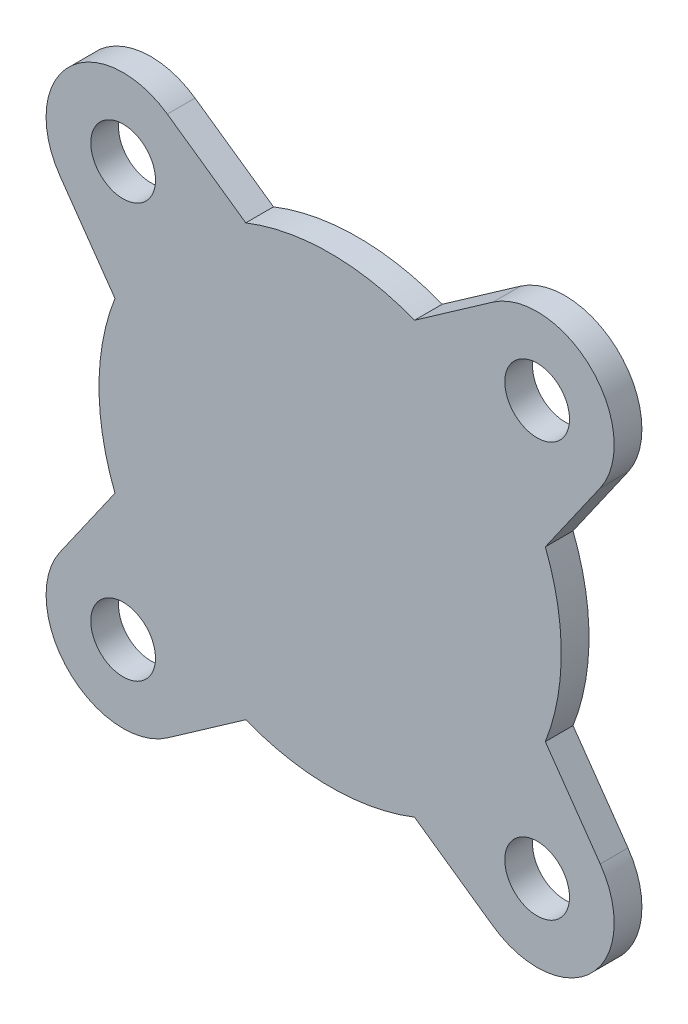
ISO-10303-21;
HEADER;
FILE_DESCRIPTION(('STEP AP214'),'2;1');
FILE_NAME('part.step','',(''),(''),'','','');
FILE_SCHEMA(('AUTOMOTIVE_DESIGN { 1 0 10303 214 1 1 1 1 }'));
ENDSEC;
DATA;
#1=APPLICATION_CONTEXT('core data for automotive mechanical design processes');
#2=APPLICATION_PROTOCOL_DEFINITION('international standard','automotive_design',2000,#1);
#3=PRODUCT_CONTEXT('',#1,'mechanical');
#4=PRODUCT('Part','Part','',(#3));
#5=PRODUCT_RELATED_PRODUCT_CATEGORY('part','',(#4));
#6=PRODUCT_DEFINITION_FORMATION('','',#4);
#7=PRODUCT_DEFINITION_CONTEXT('part definition',#1,'design');
#8=PRODUCT_DEFINITION('design','',#6,#7);
#9=PRODUCT_DEFINITION_SHAPE('','',#8);
#10=(LENGTH_UNIT() NAMED_UNIT(*) SI_UNIT(.MILLI.,.METRE.));
#11=(NAMED_UNIT(*) PLANE_ANGLE_UNIT() SI_UNIT($,.RADIAN.));
#12=(NAMED_UNIT(*) SI_UNIT($,.STERADIAN.) SOLID_ANGLE_UNIT());
#13=UNCERTAINTY_MEASURE_WITH_UNIT(LENGTH_MEASURE(1.E-05),#10,'distance_accuracy_value','');
#14=(GEOMETRIC_REPRESENTATION_CONTEXT(3) GLOBAL_UNCERTAINTY_ASSIGNED_CONTEXT((#13)) GLOBAL_UNIT_ASSIGNED_CONTEXT((#10,
#11,#12)) REPRESENTATION_CONTEXT('',''));
#15=CARTESIAN_POINT('',(0.,0.,0.));
#16=DIRECTION('',(0.,0.,1.));
#17=DIRECTION('',(1.,0.,0.));
#18=AXIS2_PLACEMENT_3D('',#15,#16,#17);
#19=CARTESIAN_POINT('',(0.,0.,0.9));
#20=DIRECTION('',(0.,0.,-1.));
#21=DIRECTION('',(-1.,0.,0.));
#22=AXIS2_PLACEMENT_3D('',#19,#20,#21);
#23=CYLINDRICAL_SURFACE('',#22,7.5);
#24=CARTESIAN_POINT('',(0.,0.,0.));
#25=DIRECTION('',(0.,0.,1.));
#26=DIRECTION('',(1.,0.,0.));
#27=AXIS2_PLACEMENT_3D('',#24,#25,#26);
#28=CIRCLE('',#27,7.5);
#29=CARTESIAN_POINT('',(2.73744653020183,6.9825773532619,0.));
#30=VERTEX_POINT('',#29);
#31=CARTESIAN_POINT('',(-2.73744653020183,6.9825773532619,0.));
#32=VERTEX_POINT('',#31);
#33=EDGE_CURVE('E375',#30,#32,#28,.T.);
#34=ORIENTED_EDGE('',*,*,#33,.T.);
#35=DIRECTION('',(0.,0.,-1.));
#36=VECTOR('',#35,1.);
#37=CARTESIAN_POINT('',(-2.73744653020183,6.9825773532619,0.9));
#38=LINE('',#37,#36);
#39=CARTESIAN_POINT('',(-2.73744653020183,6.9825773532619,0.9));
#40=VERTEX_POINT('',#39);
#41=EDGE_CURVE('E417',#40,#32,#38,.T.);
#42=ORIENTED_EDGE('',*,*,#41,.F.);
#43=CARTESIAN_POINT('',(0.,0.,0.9));
#44=DIRECTION('',(0.,0.,1.));
#45=DIRECTION('',(1.,0.,0.));
#46=AXIS2_PLACEMENT_3D('',#43,#44,#45);
#47=CIRCLE('',#46,7.5);
#48=CARTESIAN_POINT('',(2.73744653020183,6.9825773532619,0.9));
#49=VERTEX_POINT('',#48);
#50=EDGE_CURVE('E457',#49,#40,#47,.T.);
#51=ORIENTED_EDGE('',*,*,#50,.F.);
#52=DIRECTION('',(0.,0.,-1.));
#53=VECTOR('',#52,1.);
#54=CARTESIAN_POINT('',(2.73744653020183,6.9825773532619,0.9));
#55=LINE('',#54,#53);
#56=EDGE_CURVE('E419',#49,#30,#55,.T.);
#57=ORIENTED_EDGE('',*,*,#56,.T.);
#58=EDGE_LOOP('',(#34,#42,#51,#57));
#59=FACE_BOUND('',#58,.T.);
#60=ADVANCED_FACE('F205',(#59),#23,.T.);
#61=CARTESIAN_POINT('',(6.9825773532619,-2.73744653020183,0.));
#62=VERTEX_POINT('',#61);
#63=CARTESIAN_POINT('',(6.98257735326193,2.73744653020175,0.));
#64=VERTEX_POINT('',#63);
#65=EDGE_CURVE('E370',#62,#64,#28,.T.);
#66=ORIENTED_EDGE('',*,*,#65,.T.);
#67=DIRECTION('',(0.,0.,-1.));
#68=VECTOR('',#67,1.);
#69=CARTESIAN_POINT('',(6.98257735326193,2.73744653020175,0.9));
#70=LINE('',#69,#68);
#71=CARTESIAN_POINT('',(6.98257735326193,2.73744653020175,0.9));
#72=VERTEX_POINT('',#71);
#73=EDGE_CURVE('E426',#72,#64,#70,.T.);
#74=ORIENTED_EDGE('',*,*,#73,.F.);
#75=CARTESIAN_POINT('',(6.9825773532619,-2.73744653020183,0.9));
#76=VERTEX_POINT('',#75);
#77=EDGE_CURVE('E350',#76,#72,#47,.T.);
#78=ORIENTED_EDGE('',*,*,#77,.F.);
#79=DIRECTION('',(0.,0.,-1.));
#80=VECTOR('',#79,1.);
#81=CARTESIAN_POINT('',(6.9825773532619,-2.73744653020183,0.9));
#82=LINE('',#81,#80);
#83=EDGE_CURVE('E428',#76,#62,#82,.T.);
#84=ORIENTED_EDGE('',*,*,#83,.T.);
#85=EDGE_LOOP('',(#66,#74,#78,#84));
#86=FACE_BOUND('',#85,.T.);
#87=ADVANCED_FACE('F498',(#86),#23,.T.);
#88=CARTESIAN_POINT('',(-2.73744653020174,-6.98257735326193,0.));
#89=VERTEX_POINT('',#88);
#90=CARTESIAN_POINT('',(2.73744653020174,-6.98257735326193,0.));
#91=VERTEX_POINT('',#90);
#92=EDGE_CURVE('E374',#89,#91,#28,.T.);
#93=ORIENTED_EDGE('',*,*,#92,.T.);
#94=DIRECTION('',(0.,0.,-1.));
#95=VECTOR('',#94,1.);
#96=CARTESIAN_POINT('',(2.73744653020174,-6.98257735326193,0.9));
#97=LINE('',#96,#95);
#98=CARTESIAN_POINT('',(2.73744653020174,-6.98257735326193,0.9));
#99=VERTEX_POINT('',#98);
#100=EDGE_CURVE('E224',#99,#91,#97,.T.);
#101=ORIENTED_EDGE('',*,*,#100,.F.);
#102=CARTESIAN_POINT('',(-2.73744653020174,-6.98257735326193,0.9));
#103=VERTEX_POINT('',#102);
#104=EDGE_CURVE('E345',#103,#99,#47,.T.);
#105=ORIENTED_EDGE('',*,*,#104,.F.);
#106=DIRECTION('',(0.,0.,-1.));
#107=VECTOR('',#106,1.);
#108=CARTESIAN_POINT('',(-2.73744653020174,-6.98257735326193,0.9));
#109=LINE('',#108,#107);
#110=EDGE_CURVE('E273',#103,#89,#109,.T.);
#111=ORIENTED_EDGE('',*,*,#110,.T.);
#112=EDGE_LOOP('',(#93,#101,#105,#111));
#113=FACE_BOUND('',#112,.T.);
#114=ADVANCED_FACE('F495',(#113),#23,.T.);
#115=CARTESIAN_POINT('',(-6.98257735326193,2.73744653020175,0.));
#116=VERTEX_POINT('',#115);
#117=CARTESIAN_POINT('',(-6.9825773532619,-2.73744653020183,0.));
#118=VERTEX_POINT('',#117);
#119=EDGE_CURVE('E389',#116,#118,#28,.T.);
#120=ORIENTED_EDGE('',*,*,#119,.T.);
#121=DIRECTION('',(0.,0.,-1.));
#122=VECTOR('',#121,1.);
#123=CARTESIAN_POINT('',(-6.9825773532619,-2.73744653020183,0.9));
#124=LINE('',#123,#122);
#125=CARTESIAN_POINT('',(-6.9825773532619,-2.73744653020183,0.9));
#126=VERTEX_POINT('',#125);
#127=EDGE_CURVE('E409',#126,#118,#124,.T.);
#128=ORIENTED_EDGE('',*,*,#127,.F.);
#129=CARTESIAN_POINT('',(-6.98257735326193,2.73744653020175,0.9));
#130=VERTEX_POINT('',#129);
#131=EDGE_CURVE('E349',#130,#126,#47,.T.);
#132=ORIENTED_EDGE('',*,*,#131,.F.);
#133=DIRECTION('',(0.,0.,-1.));
#134=VECTOR('',#133,1.);
#135=CARTESIAN_POINT('',(-6.98257735326193,2.73744653020175,0.9));
#136=LINE('',#135,#134);
#137=EDGE_CURVE('E411',#130,#116,#136,.T.);
#138=ORIENTED_EDGE('',*,*,#137,.T.);
#139=EDGE_LOOP('',(#120,#128,#132,#138));
#140=FACE_BOUND('',#139,.T.);
#141=ADVANCED_FACE('F497',(#140),#23,.T.);
#142=CARTESIAN_POINT('',(0.,0.,0.9));
#143=DIRECTION('',(0.,0.,1.));
#144=DIRECTION('',(1.,0.,0.));
#145=AXIS2_PLACEMENT_3D('',#142,#143,#144);
#146=PLANE('',#145);
#147=DIRECTION('',(0.819152044288996,-0.57357643635104,0.));
#148=VECTOR('',#147,1.);
#149=CARTESIAN_POINT('',(2.38014586866558,3.39920057809028,0.9));
#150=LINE('',#149,#148);
#151=CARTESIAN_POINT('',(-5.28357333039463,8.76539453199464,0.9));
#152=VERTEX_POINT('',#151);
#153=EDGE_CURVE('E455',#152,#40,#150,.T.);
#154=ORIENTED_EDGE('',*,*,#153,.F.);
#155=CARTESIAN_POINT('',(-6.7175144212722,6.7175144212722,0.9));
#156=DIRECTION('',(0.,0.,1.));
#157=DIRECTION('',(1.,0.,0.));
#158=AXIS2_PLACEMENT_3D('',#155,#156,#157);
#159=CIRCLE('',#158,2.5);
#160=CARTESIAN_POINT('',(-8.7653945319947,5.28357333039453,0.9));
#161=VERTEX_POINT('',#160);
#162=EDGE_CURVE('E365',#152,#161,#159,.T.);
#163=ORIENTED_EDGE('',*,*,#162,.T.);
#164=DIRECTION('',(0.57357643635105,-0.819152044288989,0.));
#165=VECTOR('',#164,1.);
#166=CARTESIAN_POINT('',(-3.39920057809025,-2.38014586866562,0.9));
#167=LINE('',#166,#165);
#168=EDGE_CURVE('E453',#161,#130,#167,.T.);
#169=ORIENTED_EDGE('',*,*,#168,.T.);
#170=ORIENTED_EDGE('',*,*,#131,.T.);
#171=DIRECTION('',(0.573576436351041,0.819152044288996,0.));
#172=VECTOR('',#171,1.);
#173=CARTESIAN_POINT('',(-3.39920057809027,2.38014586866558,0.9));
#174=LINE('',#173,#172);
#175=CARTESIAN_POINT('',(-8.76539453199468,-5.28357333039461,0.9));
#176=VERTEX_POINT('',#175);
#177=EDGE_CURVE('E332',#176,#126,#174,.T.);
#178=ORIENTED_EDGE('',*,*,#177,.F.);
#179=CARTESIAN_POINT('',(-6.71751442127223,-6.71751442127216,0.9));
#180=DIRECTION('',(0.,0.,1.));
#181=DIRECTION('',(1.,0.,0.));
#182=AXIS2_PLACEMENT_3D('',#179,#180,#181);
#183=CIRCLE('',#182,2.5);
#184=CARTESIAN_POINT('',(-5.28357333039456,-8.76539453199467,0.9));
#185=VERTEX_POINT('',#184);
#186=EDGE_CURVE('E323',#176,#185,#183,.T.);
#187=ORIENTED_EDGE('',*,*,#186,.T.);
#188=DIRECTION('',(0.819152044288989,0.57357643635105,0.));
#189=VECTOR('',#188,1.);
#190=CARTESIAN_POINT('',(2.38014586866562,-3.39920057809026,0.9));
#191=LINE('',#190,#189);
#192=EDGE_CURVE('E329',#185,#103,#191,.T.);
#193=ORIENTED_EDGE('',*,*,#192,.T.);
#194=ORIENTED_EDGE('',*,*,#104,.T.);
#195=DIRECTION('',(-0.81915204428899,0.573576436351049,0.));
#196=VECTOR('',#195,1.);
#197=CARTESIAN_POINT('',(-2.38014586866562,-3.39920057809026,0.9));
#198=LINE('',#197,#196);
#199=CARTESIAN_POINT('',(5.28357333039455,-8.76539453199468,0.9));
#200=VERTEX_POINT('',#199);
#201=EDGE_CURVE('E405',#200,#99,#198,.T.);
#202=ORIENTED_EDGE('',*,*,#201,.F.);
#203=CARTESIAN_POINT('',(6.7175144212722,-6.7175144212722,0.9));
#204=DIRECTION('',(0.,0.,1.));
#205=DIRECTION('',(1.,0.,0.));
#206=AXIS2_PLACEMENT_3D('',#203,#204,#205);
#207=CIRCLE('',#206,2.5);
#208=CARTESIAN_POINT('',(8.76539453199467,-5.28357333039461,0.9));
#209=VERTEX_POINT('',#208);
#210=EDGE_CURVE('E488',#200,#209,#207,.T.);
#211=ORIENTED_EDGE('',*,*,#210,.T.);
#212=DIRECTION('',(-0.573576436351041,0.819152044288995,0.));
#213=VECTOR('',#212,1.);
#214=CARTESIAN_POINT('',(3.39920057809027,2.38014586866558,0.9));
#215=LINE('',#214,#213);
#216=EDGE_CURVE('E483',#209,#76,#215,.T.);
#217=ORIENTED_EDGE('',*,*,#216,.T.);
#218=ORIENTED_EDGE('',*,*,#77,.T.);
#219=DIRECTION('',(-0.573576436351049,-0.819152044288989,0.));
#220=VECTOR('',#219,1.);
#221=CARTESIAN_POINT('',(3.39920057809026,-2.38014586866562,0.9));
#222=LINE('',#221,#220);
#223=CARTESIAN_POINT('',(8.76539453199471,5.28357333039454,0.9));
#224=VERTEX_POINT('',#223);
#225=EDGE_CURVE('E482',#224,#72,#222,.T.);
#226=ORIENTED_EDGE('',*,*,#225,.F.);
#227=CARTESIAN_POINT('',(6.71751442127224,6.71751442127216,0.9));
#228=DIRECTION('',(0.,0.,1.));
#229=DIRECTION('',(1.,0.,0.));
#230=AXIS2_PLACEMENT_3D('',#227,#228,#229);
#231=CIRCLE('',#230,2.5);
#232=CARTESIAN_POINT('',(5.28357333039463,8.76539453199465,0.9));
#233=VERTEX_POINT('',#232);
#234=EDGE_CURVE('E478',#224,#233,#231,.T.);
#235=ORIENTED_EDGE('',*,*,#234,.T.);
#236=DIRECTION('',(-0.819152044288995,-0.573576436351041,0.));
#237=VECTOR('',#236,1.);
#238=CARTESIAN_POINT('',(-2.38014586866558,3.39920057809028,0.9));
#239=LINE('',#238,#237);
#240=EDGE_CURVE('E477',#233,#49,#239,.T.);
#241=ORIENTED_EDGE('',*,*,#240,.T.);
#242=ORIENTED_EDGE('',*,*,#50,.T.);
#243=EDGE_LOOP('',(#154,#163,#169,#170,#178,#187,#193,#194,#202,#211,#217,#218,#226,#235,#241,#242));
#244=FACE_BOUND('',#243,.T.);
#245=CARTESIAN_POINT('',(-6.71751442127223,-6.71751442127216,0.9));
#246=DIRECTION('',(0.,0.,1.));
#247=DIRECTION('',(1.,0.,0.));
#248=AXIS2_PLACEMENT_3D('',#245,#246,#247);
#249=CIRCLE('',#248,1.05);
#250=CARTESIAN_POINT('',(-5.66751442127223,-6.71751442127216,0.9));
#251=VERTEX_POINT('',#250);
#252=EDGE_CURVE('E347',#251,#251,#249,.T.);
#253=ORIENTED_EDGE('',*,*,#252,.F.);
#254=EDGE_LOOP('',(#253));
#255=FACE_BOUND('',#254,.T.);
#256=CARTESIAN_POINT('',(6.7175144212722,-6.7175144212722,0.9));
#257=DIRECTION('',(0.,0.,1.));
#258=DIRECTION('',(1.,0.,0.));
#259=AXIS2_PLACEMENT_3D('',#256,#257,#258);
#260=CIRCLE('',#259,1.05);
#261=CARTESIAN_POINT('',(7.7675144212722,-6.7175144212722,0.9));
#262=VERTEX_POINT('',#261);
#263=EDGE_CURVE('E358',#262,#262,#260,.T.);
#264=ORIENTED_EDGE('',*,*,#263,.F.);
#265=EDGE_LOOP('',(#264));
#266=FACE_BOUND('',#265,.T.);
#267=CARTESIAN_POINT('',(6.71751442127224,6.71751442127216,0.9));
#268=DIRECTION('',(0.,0.,1.));
#269=DIRECTION('',(1.,0.,0.));
#270=AXIS2_PLACEMENT_3D('',#267,#268,#269);
#271=CIRCLE('',#270,1.04999999999999);
#272=CARTESIAN_POINT('',(7.76751442127223,6.71751442127216,0.9));
#273=VERTEX_POINT('',#272);
#274=EDGE_CURVE('E355',#273,#273,#271,.T.);
#275=ORIENTED_EDGE('',*,*,#274,.F.);
#276=EDGE_LOOP('',(#275));
#277=FACE_BOUND('',#276,.T.);
#278=CARTESIAN_POINT('',(-6.7175144212722,6.7175144212722,0.9));
#279=DIRECTION('',(0.,0.,1.));
#280=DIRECTION('',(1.,0.,0.));
#281=AXIS2_PLACEMENT_3D('',#278,#279,#280);
#282=CIRCLE('',#281,1.05);
#283=CARTESIAN_POINT('',(-5.6675144212722,6.7175144212722,0.9));
#284=VERTEX_POINT('',#283);
#285=EDGE_CURVE('E432',#284,#284,#282,.T.);
#286=ORIENTED_EDGE('',*,*,#285,.F.);
#287=EDGE_LOOP('',(#286));
#288=FACE_BOUND('',#287,.T.);
#289=ADVANCED_FACE('F326',(#244,#255,#266,#277,#288),#146,.T.);
#290=CARTESIAN_POINT('',(-3.39920057809025,-2.38014586866562,0.9));
#291=DIRECTION('',(0.819152044288989,0.57357643635105,0.));
#292=DIRECTION('',(-0.57357643635105,0.819152044288989,0.));
#293=AXIS2_PLACEMENT_3D('',#290,#291,#292);
#294=PLANE('',#293);
#295=DIRECTION('',(0.57357643635105,-0.819152044288989,0.));
#296=VECTOR('',#295,1.);
#297=CARTESIAN_POINT('',(-3.39920057809025,-2.38014586866562,0.));
#298=LINE('',#297,#296);
#299=CARTESIAN_POINT('',(-8.7653945319947,5.28357333039453,0.));
#300=VERTEX_POINT('',#299);
#301=EDGE_CURVE('E386',#300,#116,#298,.T.);
#302=ORIENTED_EDGE('',*,*,#301,.T.);
#303=ORIENTED_EDGE('',*,*,#137,.F.);
#304=ORIENTED_EDGE('',*,*,#168,.F.);
#305=DIRECTION('',(0.,0.,-1.));
#306=VECTOR('',#305,1.);
#307=CARTESIAN_POINT('',(-8.7653945319947,5.28357333039453,0.9));
#308=LINE('',#307,#306);
#309=EDGE_CURVE('E413',#161,#300,#308,.T.);
#310=ORIENTED_EDGE('',*,*,#309,.T.);
#311=EDGE_LOOP('',(#302,#303,#304,#310));
#312=FACE_BOUND('',#311,.T.);
#313=ADVANCED_FACE('F452',(#312),#294,.F.);
#314=CARTESIAN_POINT('',(2.38014586866558,3.39920057809028,0.9));
#315=DIRECTION('',(0.57357643635104,0.819152044288996,0.));
#316=DIRECTION('',(-0.819152044288996,0.57357643635104,0.));
#317=AXIS2_PLACEMENT_3D('',#314,#315,#316);
#318=PLANE('',#317);
#319=DIRECTION('',(0.819152044288996,-0.57357643635104,0.));
#320=VECTOR('',#319,1.);
#321=CARTESIAN_POINT('',(2.38014586866558,3.39920057809028,0.));
#322=LINE('',#321,#320);
#323=CARTESIAN_POINT('',(-5.28357333039463,8.76539453199464,0.));
#324=VERTEX_POINT('',#323);
#325=EDGE_CURVE('E383',#324,#32,#322,.T.);
#326=ORIENTED_EDGE('',*,*,#325,.F.);
#327=DIRECTION('',(0.,0.,-1.));
#328=VECTOR('',#327,1.);
#329=CARTESIAN_POINT('',(-5.28357333039463,8.76539453199464,0.9));
#330=LINE('',#329,#328);
#331=EDGE_CURVE('E415',#152,#324,#330,.T.);
#332=ORIENTED_EDGE('',*,*,#331,.F.);
#333=ORIENTED_EDGE('',*,*,#153,.T.);
#334=ORIENTED_EDGE('',*,*,#41,.T.);
#335=EDGE_LOOP('',(#326,#332,#333,#334));
#336=FACE_BOUND('',#335,.T.);
#337=ADVANCED_FACE('F474',(#336),#318,.T.);
#338=CARTESIAN_POINT('',(0.,0.,0.));
#339=DIRECTION('',(0.,0.,1.));
#340=DIRECTION('',(1.,0.,0.));
#341=AXIS2_PLACEMENT_3D('',#338,#339,#340);
#342=PLANE('',#341);
#343=CARTESIAN_POINT('',(-6.7175144212722,6.7175144212722,0.));
#344=DIRECTION('',(0.,0.,1.));
#345=DIRECTION('',(1.,0.,0.));
#346=AXIS2_PLACEMENT_3D('',#343,#344,#345);
#347=CIRCLE('',#346,2.5);
#348=EDGE_CURVE('E209',#324,#300,#347,.T.);
#349=ORIENTED_EDGE('',*,*,#348,.F.);
#350=ORIENTED_EDGE('',*,*,#325,.T.);
#351=ORIENTED_EDGE('',*,*,#33,.F.);
#352=DIRECTION('',(-0.819152044288995,-0.573576436351041,0.));
#353=VECTOR('',#352,1.);
#354=CARTESIAN_POINT('',(-2.38014586866558,3.39920057809028,0.));
#355=LINE('',#354,#353);
#356=CARTESIAN_POINT('',(5.28357333039463,8.76539453199465,0.));
#357=VERTEX_POINT('',#356);
#358=EDGE_CURVE('E380',#357,#30,#355,.T.);
#359=ORIENTED_EDGE('',*,*,#358,.F.);
#360=CARTESIAN_POINT('',(6.71751442127224,6.71751442127216,0.));
#361=DIRECTION('',(0.,0.,1.));
#362=DIRECTION('',(1.,0.,0.));
#363=AXIS2_PLACEMENT_3D('',#360,#361,#362);
#364=CIRCLE('',#363,2.5);
#365=CARTESIAN_POINT('',(8.76539453199471,5.28357333039454,0.));
#366=VERTEX_POINT('',#365);
#367=EDGE_CURVE('E378',#366,#357,#364,.T.);
#368=ORIENTED_EDGE('',*,*,#367,.F.);
#369=DIRECTION('',(-0.573576436351049,-0.819152044288989,0.));
#370=VECTOR('',#369,1.);
#371=CARTESIAN_POINT('',(3.39920057809026,-2.38014586866562,0.));
#372=LINE('',#371,#370);
#373=EDGE_CURVE('E373',#366,#64,#372,.T.);
#374=ORIENTED_EDGE('',*,*,#373,.T.);
#375=ORIENTED_EDGE('',*,*,#65,.F.);
#376=DIRECTION('',(-0.573576436351041,0.819152044288995,0.));
#377=VECTOR('',#376,1.);
#378=CARTESIAN_POINT('',(3.39920057809027,2.38014586866558,0.));
#379=LINE('',#378,#377);
#380=CARTESIAN_POINT('',(8.76539453199467,-5.28357333039461,0.));
#381=VERTEX_POINT('',#380);
#382=EDGE_CURVE('E367',#381,#62,#379,.T.);
#383=ORIENTED_EDGE('',*,*,#382,.F.);
#384=CARTESIAN_POINT('',(6.7175144212722,-6.7175144212722,0.));
#385=DIRECTION('',(0.,0.,1.));
#386=DIRECTION('',(1.,0.,0.));
#387=AXIS2_PLACEMENT_3D('',#384,#385,#386);
#388=CIRCLE('',#387,2.5);
#389=CARTESIAN_POINT('',(5.28357333039455,-8.76539453199468,0.));
#390=VERTEX_POINT('',#389);
#391=EDGE_CURVE('E364',#390,#381,#388,.T.);
#392=ORIENTED_EDGE('',*,*,#391,.F.);
#393=DIRECTION('',(-0.81915204428899,0.573576436351049,0.));
#394=VECTOR('',#393,1.);
#395=CARTESIAN_POINT('',(-2.38014586866562,-3.39920057809026,0.));
#396=LINE('',#395,#394);
#397=EDGE_CURVE('E361',#390,#91,#396,.T.);
#398=ORIENTED_EDGE('',*,*,#397,.T.);
#399=ORIENTED_EDGE('',*,*,#92,.F.);
#400=DIRECTION('',(0.819152044288989,0.57357643635105,0.));
#401=VECTOR('',#400,1.);
#402=CARTESIAN_POINT('',(2.38014586866562,-3.39920057809026,0.));
#403=LINE('',#402,#401);
#404=CARTESIAN_POINT('',(-5.28357333039456,-8.76539453199467,0.));
#405=VERTEX_POINT('',#404);
#406=EDGE_CURVE('E394',#405,#89,#403,.T.);
#407=ORIENTED_EDGE('',*,*,#406,.F.);
#408=CARTESIAN_POINT('',(-6.71751442127223,-6.71751442127216,0.));
#409=DIRECTION('',(0.,0.,1.));
#410=DIRECTION('',(1.,0.,0.));
#411=AXIS2_PLACEMENT_3D('',#408,#409,#410);
#412=CIRCLE('',#411,2.5);
#413=CARTESIAN_POINT('',(-8.76539453199468,-5.28357333039461,0.));
#414=VERTEX_POINT('',#413);
#415=EDGE_CURVE('E339',#414,#405,#412,.T.);
#416=ORIENTED_EDGE('',*,*,#415,.F.);
#417=DIRECTION('',(0.573576436351041,0.819152044288996,0.));
#418=VECTOR('',#417,1.);
#419=CARTESIAN_POINT('',(-3.39920057809027,2.38014586866558,0.));
#420=LINE('',#419,#418);
#421=EDGE_CURVE('E390',#414,#118,#420,.T.);
#422=ORIENTED_EDGE('',*,*,#421,.T.);
#423=ORIENTED_EDGE('',*,*,#119,.F.);
#424=ORIENTED_EDGE('',*,*,#301,.F.);
#425=EDGE_LOOP('',(#349,#350,#351,#359,#368,#374,#375,#383,#392,#398,#399,#407,#416,#422,#423,#424));
#426=FACE_BOUND('',#425,.T.);
#427=CARTESIAN_POINT('',(6.71751442127224,6.71751442127216,0.));
#428=DIRECTION('',(0.,0.,1.));
#429=DIRECTION('',(1.,0.,0.));
#430=AXIS2_PLACEMENT_3D('',#427,#428,#429);
#431=CIRCLE('',#430,1.04999999999999);
#432=CARTESIAN_POINT('',(7.76751442127223,6.71751442127216,0.));
#433=VERTEX_POINT('',#432);
#434=EDGE_CURVE('E399',#433,#433,#431,.T.);
#435=ORIENTED_EDGE('',*,*,#434,.T.);
#436=EDGE_LOOP('',(#435));
#437=FACE_BOUND('',#436,.T.);
#438=CARTESIAN_POINT('',(6.7175144212722,-6.7175144212722,0.));
#439=DIRECTION('',(0.,0.,1.));
#440=DIRECTION('',(1.,0.,0.));
#441=AXIS2_PLACEMENT_3D('',#438,#439,#440);
#442=CIRCLE('',#441,1.05);
#443=CARTESIAN_POINT('',(7.7675144212722,-6.7175144212722,0.));
#444=VERTEX_POINT('',#443);
#445=EDGE_CURVE('E402',#444,#444,#442,.T.);
#446=ORIENTED_EDGE('',*,*,#445,.T.);
#447=EDGE_LOOP('',(#446));
#448=FACE_BOUND('',#447,.T.);
#449=CARTESIAN_POINT('',(-6.71751442127223,-6.71751442127216,0.));
#450=DIRECTION('',(0.,0.,1.));
#451=DIRECTION('',(1.,0.,0.));
#452=AXIS2_PLACEMENT_3D('',#449,#450,#451);
#453=CIRCLE('',#452,1.05);
#454=CARTESIAN_POINT('',(-5.66751442127223,-6.71751442127216,0.));
#455=VERTEX_POINT('',#454);
#456=EDGE_CURVE('E396',#455,#455,#453,.T.);
#457=ORIENTED_EDGE('',*,*,#456,.T.);
#458=EDGE_LOOP('',(#457));
#459=FACE_BOUND('',#458,.T.);
#460=CARTESIAN_POINT('',(-6.7175144212722,6.7175144212722,0.));
#461=DIRECTION('',(0.,0.,1.));
#462=DIRECTION('',(1.,0.,0.));
#463=AXIS2_PLACEMENT_3D('',#460,#461,#462);
#464=CIRCLE('',#463,1.05);
#465=CARTESIAN_POINT('',(-5.6675144212722,6.7175144212722,0.));
#466=VERTEX_POINT('',#465);
#467=EDGE_CURVE('E435',#466,#466,#464,.T.);
#468=ORIENTED_EDGE('',*,*,#467,.T.);
#469=EDGE_LOOP('',(#468));
#470=FACE_BOUND('',#469,.T.);
#471=ADVANCED_FACE('F448',(#426,#437,#448,#459,#470),#342,.F.);
#472=CARTESIAN_POINT('',(-6.7175144212722,6.7175144212722,0.9));
#473=DIRECTION('',(0.,0.,-1.));
#474=DIRECTION('',(-1.,0.,0.));
#475=AXIS2_PLACEMENT_3D('',#472,#473,#474);
#476=CYLINDRICAL_SURFACE('',#475,1.05);
#477=ORIENTED_EDGE('',*,*,#285,.T.);
#478=EDGE_LOOP('',(#477));
#479=FACE_BOUND('',#478,.T.);
#480=ORIENTED_EDGE('',*,*,#467,.F.);
#481=EDGE_LOOP('',(#480));
#482=FACE_BOUND('',#481,.T.);
#483=ADVANCED_FACE('F518',(#479,#482),#476,.F.);
#484=CARTESIAN_POINT('',(-6.7175144212722,6.7175144212722,0.9));
#485=DIRECTION('',(0.,0.,-1.));
#486=DIRECTION('',(-1.,0.,0.));
#487=AXIS2_PLACEMENT_3D('',#484,#485,#486);
#488=CYLINDRICAL_SURFACE('',#487,2.5);
#489=ORIENTED_EDGE('',*,*,#162,.F.);
#490=ORIENTED_EDGE('',*,*,#331,.T.);
#491=ORIENTED_EDGE('',*,*,#348,.T.);
#492=ORIENTED_EDGE('',*,*,#309,.F.);
#493=EDGE_LOOP('',(#489,#490,#491,#492));
#494=FACE_BOUND('',#493,.T.);
#495=ADVANCED_FACE('F207',(#494),#488,.T.);
#496=CARTESIAN_POINT('',(6.71751442127224,6.71751442127216,0.9));
#497=DIRECTION('',(0.,0.,-1.));
#498=DIRECTION('',(-1.,0.,0.));
#499=AXIS2_PLACEMENT_3D('',#496,#497,#498);
#500=CYLINDRICAL_SURFACE('',#499,2.5);
#501=ORIENTED_EDGE('',*,*,#367,.T.);
#502=DIRECTION('',(0.,0.,-1.));
#503=VECTOR('',#502,1.);
#504=CARTESIAN_POINT('',(5.28357333039463,8.76539453199465,0.9));
#505=LINE('',#504,#503);
#506=EDGE_CURVE('E421',#233,#357,#505,.T.);
#507=ORIENTED_EDGE('',*,*,#506,.F.);
#508=ORIENTED_EDGE('',*,*,#234,.F.);
#509=DIRECTION('',(0.,0.,-1.));
#510=VECTOR('',#509,1.);
#511=CARTESIAN_POINT('',(8.76539453199471,5.28357333039454,0.9));
#512=LINE('',#511,#510);
#513=EDGE_CURVE('E424',#224,#366,#512,.T.);
#514=ORIENTED_EDGE('',*,*,#513,.T.);
#515=EDGE_LOOP('',(#501,#507,#508,#514));
#516=FACE_BOUND('',#515,.T.);
#517=ADVANCED_FACE('F532',(#516),#500,.T.);
#518=CARTESIAN_POINT('',(-2.38014586866558,3.39920057809028,0.9));
#519=DIRECTION('',(0.573576436351041,-0.819152044288995,0.));
#520=DIRECTION('',(0.819152044288995,0.573576436351041,0.));
#521=AXIS2_PLACEMENT_3D('',#518,#519,#520);
#522=PLANE('',#521);
#523=ORIENTED_EDGE('',*,*,#358,.T.);
#524=ORIENTED_EDGE('',*,*,#56,.F.);
#525=ORIENTED_EDGE('',*,*,#240,.F.);
#526=ORIENTED_EDGE('',*,*,#506,.T.);
#527=EDGE_LOOP('',(#523,#524,#525,#526));
#528=FACE_BOUND('',#527,.T.);
#529=ADVANCED_FACE('F548',(#528),#522,.F.);
#530=CARTESIAN_POINT('',(3.39920057809026,-2.38014586866562,0.9));
#531=DIRECTION('',(0.819152044288989,-0.573576436351049,0.));
#532=DIRECTION('',(0.573576436351049,0.819152044288989,0.));
#533=AXIS2_PLACEMENT_3D('',#530,#531,#532);
#534=PLANE('',#533);
#535=ORIENTED_EDGE('',*,*,#373,.F.);
#536=ORIENTED_EDGE('',*,*,#513,.F.);
#537=ORIENTED_EDGE('',*,*,#225,.T.);
#538=ORIENTED_EDGE('',*,*,#73,.T.);
#539=EDGE_LOOP('',(#535,#536,#537,#538));
#540=FACE_BOUND('',#539,.T.);
#541=ADVANCED_FACE('F545',(#540),#534,.T.);
#542=CARTESIAN_POINT('',(6.71751442127224,6.71751442127216,0.9));
#543=DIRECTION('',(0.,0.,-1.));
#544=DIRECTION('',(-1.,0.,0.));
#545=AXIS2_PLACEMENT_3D('',#542,#543,#544);
#546=CYLINDRICAL_SURFACE('',#545,1.04999999999999);
#547=ORIENTED_EDGE('',*,*,#274,.T.);
#548=EDGE_LOOP('',(#547));
#549=FACE_BOUND('',#548,.T.);
#550=ORIENTED_EDGE('',*,*,#434,.F.);
#551=EDGE_LOOP('',(#550));
#552=FACE_BOUND('',#551,.T.);
#553=ADVANCED_FACE('F508',(#549,#552),#546,.F.);
#554=CARTESIAN_POINT('',(6.7175144212722,-6.7175144212722,0.9));
#555=DIRECTION('',(0.,0.,-1.));
#556=DIRECTION('',(-1.,0.,0.));
#557=AXIS2_PLACEMENT_3D('',#554,#555,#556);
#558=CYLINDRICAL_SURFACE('',#557,2.5);
#559=ORIENTED_EDGE('',*,*,#391,.T.);
#560=DIRECTION('',(0.,0.,-1.));
#561=VECTOR('',#560,1.);
#562=CARTESIAN_POINT('',(8.76539453199467,-5.28357333039461,0.9));
#563=LINE('',#562,#561);
#564=EDGE_CURVE('E215',#209,#381,#563,.T.);
#565=ORIENTED_EDGE('',*,*,#564,.F.);
#566=ORIENTED_EDGE('',*,*,#210,.F.);
#567=DIRECTION('',(0.,0.,-1.));
#568=VECTOR('',#567,1.);
#569=CARTESIAN_POINT('',(5.28357333039455,-8.76539453199468,0.9));
#570=LINE('',#569,#568);
#571=EDGE_CURVE('E12',#200,#390,#570,.T.);
#572=ORIENTED_EDGE('',*,*,#571,.T.);
#573=EDGE_LOOP('',(#559,#565,#566,#572));
#574=FACE_BOUND('',#573,.T.);
#575=ADVANCED_FACE('F507',(#574),#558,.T.);
#576=CARTESIAN_POINT('',(3.39920057809027,2.38014586866558,0.9));
#577=DIRECTION('',(-0.819152044288995,-0.573576436351041,0.));
#578=DIRECTION('',(0.573576436351041,-0.819152044288995,0.));
#579=AXIS2_PLACEMENT_3D('',#576,#577,#578);
#580=PLANE('',#579);
#581=ORIENTED_EDGE('',*,*,#382,.T.);
#582=ORIENTED_EDGE('',*,*,#83,.F.);
#583=ORIENTED_EDGE('',*,*,#216,.F.);
#584=ORIENTED_EDGE('',*,*,#564,.T.);
#585=EDGE_LOOP('',(#581,#582,#583,#584));
#586=FACE_BOUND('',#585,.T.);
#587=ADVANCED_FACE('F538',(#586),#580,.F.);
#588=CARTESIAN_POINT('',(-2.38014586866562,-3.39920057809026,0.9));
#589=DIRECTION('',(-0.573576436351049,-0.81915204428899,0.));
#590=DIRECTION('',(0.81915204428899,-0.573576436351049,0.));
#591=AXIS2_PLACEMENT_3D('',#588,#589,#590);
#592=PLANE('',#591);
#593=ORIENTED_EDGE('',*,*,#397,.F.);
#594=ORIENTED_EDGE('',*,*,#571,.F.);
#595=ORIENTED_EDGE('',*,*,#201,.T.);
#596=ORIENTED_EDGE('',*,*,#100,.T.);
#597=EDGE_LOOP('',(#593,#594,#595,#596));
#598=FACE_BOUND('',#597,.T.);
#599=ADVANCED_FACE('F493',(#598),#592,.T.);
#600=CARTESIAN_POINT('',(6.7175144212722,-6.7175144212722,0.9));
#601=DIRECTION('',(0.,0.,-1.));
#602=DIRECTION('',(-1.,0.,0.));
#603=AXIS2_PLACEMENT_3D('',#600,#601,#602);
#604=CYLINDRICAL_SURFACE('',#603,1.05);
#605=ORIENTED_EDGE('',*,*,#263,.T.);
#606=EDGE_LOOP('',(#605));
#607=FACE_BOUND('',#606,.T.);
#608=ORIENTED_EDGE('',*,*,#445,.F.);
#609=EDGE_LOOP('',(#608));
#610=FACE_BOUND('',#609,.T.);
#611=ADVANCED_FACE('F500',(#607,#610),#604,.F.);
#612=CARTESIAN_POINT('',(-6.71751442127223,-6.71751442127216,0.9));
#613=DIRECTION('',(0.,0.,-1.));
#614=DIRECTION('',(-1.,0.,0.));
#615=AXIS2_PLACEMENT_3D('',#612,#613,#614);
#616=CYLINDRICAL_SURFACE('',#615,2.5);
#617=ORIENTED_EDGE('',*,*,#415,.T.);
#618=DIRECTION('',(0.,0.,-1.));
#619=VECTOR('',#618,1.);
#620=CARTESIAN_POINT('',(-5.28357333039456,-8.76539453199467,0.9));
#621=LINE('',#620,#619);
#622=EDGE_CURVE('E336',#185,#405,#621,.T.);
#623=ORIENTED_EDGE('',*,*,#622,.F.);
#624=ORIENTED_EDGE('',*,*,#186,.F.);
#625=DIRECTION('',(0.,0.,-1.));
#626=VECTOR('',#625,1.);
#627=CARTESIAN_POINT('',(-8.76539453199468,-5.28357333039461,0.9));
#628=LINE('',#627,#626);
#629=EDGE_CURVE('E342',#176,#414,#628,.T.);
#630=ORIENTED_EDGE('',*,*,#629,.T.);
#631=EDGE_LOOP('',(#617,#623,#624,#630));
#632=FACE_BOUND('',#631,.T.);
#633=ADVANCED_FACE('F337',(#632),#616,.T.);
#634=CARTESIAN_POINT('',(2.38014586866562,-3.39920057809026,0.9));
#635=DIRECTION('',(-0.57357643635105,0.819152044288989,0.));
#636=DIRECTION('',(-0.819152044288989,-0.57357643635105,0.));
#637=AXIS2_PLACEMENT_3D('',#634,#635,#636);
#638=PLANE('',#637);
#639=ORIENTED_EDGE('',*,*,#406,.T.);
#640=ORIENTED_EDGE('',*,*,#110,.F.);
#641=ORIENTED_EDGE('',*,*,#192,.F.);
#642=ORIENTED_EDGE('',*,*,#622,.T.);
#643=EDGE_LOOP('',(#639,#640,#641,#642));
#644=FACE_BOUND('',#643,.T.);
#645=ADVANCED_FACE('F344',(#644),#638,.F.);
#646=CARTESIAN_POINT('',(-3.39920057809027,2.38014586866558,0.9));
#647=DIRECTION('',(-0.819152044288995,0.573576436351041,0.));
#648=DIRECTION('',(-0.573576436351041,-0.819152044288996,0.));
#649=AXIS2_PLACEMENT_3D('',#646,#647,#648);
#650=PLANE('',#649);
#651=ORIENTED_EDGE('',*,*,#421,.F.);
#652=ORIENTED_EDGE('',*,*,#629,.F.);
#653=ORIENTED_EDGE('',*,*,#177,.T.);
#654=ORIENTED_EDGE('',*,*,#127,.T.);
#655=EDGE_LOOP('',(#651,#652,#653,#654));
#656=FACE_BOUND('',#655,.T.);
#657=ADVANCED_FACE('F463',(#656),#650,.T.);
#658=CARTESIAN_POINT('',(-6.71751442127223,-6.71751442127216,0.9));
#659=DIRECTION('',(0.,0.,-1.));
#660=DIRECTION('',(-1.,0.,0.));
#661=AXIS2_PLACEMENT_3D('',#658,#659,#660);
#662=CYLINDRICAL_SURFACE('',#661,1.05);
#663=ORIENTED_EDGE('',*,*,#252,.T.);
#664=EDGE_LOOP('',(#663));
#665=FACE_BOUND('',#664,.T.);
#666=ORIENTED_EDGE('',*,*,#456,.F.);
#667=EDGE_LOOP('',(#666));
#668=FACE_BOUND('',#667,.T.);
#669=ADVANCED_FACE('F505',(#665,#668),#662,.F.);
#670=CLOSED_SHELL('',(#60,#87,#114,#141,#289,#313,#337,#471,#483,#495,#517,#529,#541,#553,#575,
#587,#599,#611,#633,#645,#657,#669));
#671=MANIFOLD_SOLID_BREP('B2',#670);
#672=ADVANCED_BREP_SHAPE_REPRESENTATION('',(#18,#671),#14);
#673=SHAPE_DEFINITION_REPRESENTATION(#9,#672);
ENDSEC;
END-ISO-10303-21;
